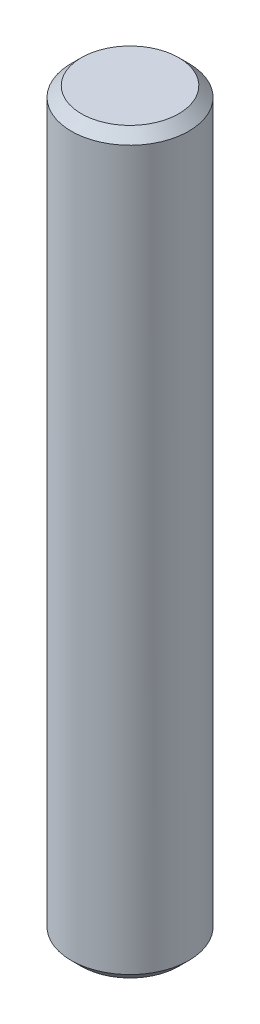
ISO-10303-21;
HEADER;
FILE_DESCRIPTION(('STEP AP214'),'2;1');
FILE_NAME('part.step','',(''),(''),'','','');
FILE_SCHEMA(('AUTOMOTIVE_DESIGN { 1 0 10303 214 1 1 1 1 }'));
ENDSEC;
DATA;
#1=APPLICATION_CONTEXT('core data for automotive mechanical design processes');
#2=APPLICATION_PROTOCOL_DEFINITION('international standard','automotive_design',2000,#1);
#3=PRODUCT_CONTEXT('',#1,'mechanical');
#4=PRODUCT('Part','Part','',(#3));
#5=PRODUCT_RELATED_PRODUCT_CATEGORY('part','',(#4));
#6=PRODUCT_DEFINITION_FORMATION('','',#4);
#7=PRODUCT_DEFINITION_CONTEXT('part definition',#1,'design');
#8=PRODUCT_DEFINITION('design','',#6,#7);
#9=PRODUCT_DEFINITION_SHAPE('','',#8);
#10=(LENGTH_UNIT() NAMED_UNIT(*) SI_UNIT(.MILLI.,.METRE.));
#11=(NAMED_UNIT(*) PLANE_ANGLE_UNIT() SI_UNIT($,.RADIAN.));
#12=(NAMED_UNIT(*) SI_UNIT($,.STERADIAN.) SOLID_ANGLE_UNIT());
#13=UNCERTAINTY_MEASURE_WITH_UNIT(LENGTH_MEASURE(1.E-05),#10,'distance_accuracy_value','');
#14=(GEOMETRIC_REPRESENTATION_CONTEXT(3) GLOBAL_UNCERTAINTY_ASSIGNED_CONTEXT((#13)) GLOBAL_UNIT_ASSIGNED_CONTEXT((#10,
#11,#12)) REPRESENTATION_CONTEXT('',''));
#15=CARTESIAN_POINT('',(0.,0.,0.));
#16=DIRECTION('',(0.,0.,1.));
#17=DIRECTION('',(1.,0.,0.));
#18=AXIS2_PLACEMENT_3D('',#15,#16,#17);
#19=CARTESIAN_POINT('',(0.,32.,0.));
#20=DIRECTION('',(0.,-1.,0.));
#21=DIRECTION('',(0.,0.,-1.));
#22=AXIS2_PLACEMENT_3D('',#19,#20,#21);
#23=CYLINDRICAL_SURFACE('',#22,3.5);
#24=CARTESIAN_POINT('',(0.,-11.4,0.));
#25=DIRECTION('',(0.,1.,0.));
#26=DIRECTION('',(0.,0.,1.));
#27=AXIS2_PLACEMENT_3D('',#24,#25,#26);
#28=CIRCLE('',#27,3.5);
#29=CARTESIAN_POINT('',(0.,-11.4,3.5));
#30=VERTEX_POINT('',#29);
#31=EDGE_CURVE('E40',#30,#30,#28,.T.);
#32=ORIENTED_EDGE('',*,*,#31,.T.);
#33=EDGE_LOOP('',(#32));
#34=FACE_BOUND('',#33,.T.);
#35=CARTESIAN_POINT('',(0.,31.4,0.));
#36=DIRECTION('',(0.,1.,0.));
#37=DIRECTION('',(0.,0.,1.));
#38=AXIS2_PLACEMENT_3D('',#35,#36,#37);
#39=CIRCLE('',#38,3.5);
#40=CARTESIAN_POINT('',(0.,31.4,-3.5));
#41=VERTEX_POINT('',#40);
#42=EDGE_CURVE('E44',#41,#41,#39,.F.);
#43=ORIENTED_EDGE('',*,*,#42,.T.);
#44=EDGE_LOOP('',(#43));
#45=FACE_BOUND('',#44,.T.);
#46=ADVANCED_FACE('F30',(#34,#45),#23,.T.);
#47=CARTESIAN_POINT('',(0.,32.,0.));
#48=DIRECTION('',(0.,1.,0.));
#49=DIRECTION('',(0.,0.,1.));
#50=AXIS2_PLACEMENT_3D('',#47,#48,#49);
#51=PLANE('',#50);
#52=CARTESIAN_POINT('',(0.,32.,0.));
#53=DIRECTION('',(0.,1.,0.));
#54=DIRECTION('',(0.,0.,1.));
#55=AXIS2_PLACEMENT_3D('',#52,#53,#54);
#56=CIRCLE('',#55,2.89999999999999);
#57=CARTESIAN_POINT('',(0.,32.,-2.89999999999999));
#58=VERTEX_POINT('',#57);
#59=EDGE_CURVE('E10',#58,#58,#56,.T.);
#60=ORIENTED_EDGE('',*,*,#59,.T.);
#61=EDGE_LOOP('',(#60));
#62=FACE_BOUND('',#61,.T.);
#63=ADVANCED_FACE('F63',(#62),#51,.T.);
#64=CARTESIAN_POINT('',(0.,-12.,0.));
#65=DIRECTION('',(0.,1.,0.));
#66=DIRECTION('',(0.,0.,1.));
#67=AXIS2_PLACEMENT_3D('',#64,#65,#66);
#68=PLANE('',#67);
#69=CARTESIAN_POINT('',(0.,-12.,0.));
#70=DIRECTION('',(0.,1.,0.));
#71=DIRECTION('',(0.,0.,1.));
#72=AXIS2_PLACEMENT_3D('',#69,#70,#71);
#73=CIRCLE('',#72,2.89999999999998);
#74=CARTESIAN_POINT('',(0.,-12.,2.89999999999998));
#75=VERTEX_POINT('',#74);
#76=EDGE_CURVE('E36',#75,#75,#73,.F.);
#77=ORIENTED_EDGE('',*,*,#76,.T.);
#78=EDGE_LOOP('',(#77));
#79=FACE_BOUND('',#78,.T.);
#80=ADVANCED_FACE('F59',(#79),#68,.F.);
#81=CARTESIAN_POINT('',(0.,-11.4,0.));
#82=DIRECTION('',(0.,1.,0.));
#83=DIRECTION('',(0.,0.,1.));
#84=AXIS2_PLACEMENT_3D('',#81,#82,#83);
#85=CONICAL_SURFACE('',#84,3.5,0.785398163397457);
#86=ORIENTED_EDGE('',*,*,#76,.F.);
#87=EDGE_LOOP('',(#86));
#88=FACE_BOUND('',#87,.T.);
#89=ORIENTED_EDGE('',*,*,#31,.F.);
#90=EDGE_LOOP('',(#89));
#91=FACE_BOUND('',#90,.T.);
#92=ADVANCED_FACE('F54',(#88,#91),#85,.T.);
#93=CARTESIAN_POINT('',(0.,32.,0.));
#94=DIRECTION('',(0.,-1.,0.));
#95=DIRECTION('',(0.,0.,-1.));
#96=AXIS2_PLACEMENT_3D('',#93,#94,#95);
#97=CONICAL_SURFACE('',#96,2.89999999999999,0.785398163397451);
#98=CARTESIAN_POINT('',(0.,31.4,-3.5));
#99=CARTESIAN_POINT('',(0.,31.40625,-3.49375));
#100=CARTESIAN_POINT('',(0.,31.4125,-3.4875));
#101=CARTESIAN_POINT('',(0.,31.425,-3.475));
#102=CARTESIAN_POINT('',(0.,31.43125,-3.46875));
#103=CARTESIAN_POINT('',(0.,31.44375,-3.45625));
#104=CARTESIAN_POINT('',(0.,31.45,-3.45));
#105=CARTESIAN_POINT('',(0.,31.4625,-3.4375));
#106=CARTESIAN_POINT('',(0.,31.46875,-3.43125));
#107=CARTESIAN_POINT('',(0.,31.48125,-3.41875));
#108=CARTESIAN_POINT('',(0.,31.4875,-3.4125));
#109=CARTESIAN_POINT('',(0.,31.5,-3.4));
#110=CARTESIAN_POINT('',(0.,31.50625,-3.39375));
#111=CARTESIAN_POINT('',(0.,31.51875,-3.38125));
#112=CARTESIAN_POINT('',(0.,31.525,-3.375));
#113=CARTESIAN_POINT('',(0.,31.5375,-3.3625));
#114=CARTESIAN_POINT('',(0.,31.54375,-3.35625));
#115=CARTESIAN_POINT('',(0.,31.55625,-3.34375));
#116=CARTESIAN_POINT('',(0.,31.5625,-3.3375));
#117=CARTESIAN_POINT('',(0.,31.575,-3.325));
#118=CARTESIAN_POINT('',(0.,31.58125,-3.31875));
#119=CARTESIAN_POINT('',(0.,31.59375,-3.30625));
#120=CARTESIAN_POINT('',(0.,31.6,-3.3));
#121=CARTESIAN_POINT('',(0.,31.6125,-3.2875));
#122=CARTESIAN_POINT('',(0.,31.61875,-3.28125));
#123=CARTESIAN_POINT('',(0.,31.63125,-3.26875));
#124=CARTESIAN_POINT('',(0.,31.6375,-3.2625));
#125=CARTESIAN_POINT('',(0.,31.65,-3.25));
#126=CARTESIAN_POINT('',(0.,31.65625,-3.24375));
#127=CARTESIAN_POINT('',(0.,31.66875,-3.23125));
#128=CARTESIAN_POINT('',(0.,31.675,-3.225));
#129=CARTESIAN_POINT('',(0.,31.6875,-3.2125));
#130=CARTESIAN_POINT('',(0.,31.69375,-3.20625));
#131=CARTESIAN_POINT('',(0.,31.70625,-3.19375));
#132=CARTESIAN_POINT('',(0.,31.7125,-3.1875));
#133=CARTESIAN_POINT('',(0.,31.725,-3.17499999999999));
#134=CARTESIAN_POINT('',(0.,31.73125,-3.16875));
#135=CARTESIAN_POINT('',(0.,31.74375,-3.15625));
#136=CARTESIAN_POINT('',(0.,31.75,-3.15));
#137=CARTESIAN_POINT('',(0.,31.7625,-3.13749999999999));
#138=CARTESIAN_POINT('',(0.,31.76875,-3.13124999999999));
#139=CARTESIAN_POINT('',(0.,31.78125,-3.11874999999999));
#140=CARTESIAN_POINT('',(0.,31.7875,-3.11249999999999));
#141=CARTESIAN_POINT('',(0.,31.8,-3.09999999999999));
#142=CARTESIAN_POINT('',(0.,31.80625,-3.09374999999999));
#143=CARTESIAN_POINT('',(0.,31.81875,-3.08124999999999));
#144=CARTESIAN_POINT('',(0.,31.825,-3.07499999999999));
#145=CARTESIAN_POINT('',(0.,31.8375,-3.06249999999999));
#146=CARTESIAN_POINT('',(0.,31.84375,-3.05624999999999));
#147=CARTESIAN_POINT('',(0.,31.85625,-3.04374999999999));
#148=CARTESIAN_POINT('',(0.,31.8625,-3.03749999999999));
#149=CARTESIAN_POINT('',(0.,31.875,-3.02499999999999));
#150=CARTESIAN_POINT('',(0.,31.88125,-3.01874999999999));
#151=CARTESIAN_POINT('',(0.,31.89375,-3.00624999999999));
#152=CARTESIAN_POINT('',(0.,31.9,-2.99999999999999));
#153=CARTESIAN_POINT('',(0.,31.9125,-2.98749999999999));
#154=CARTESIAN_POINT('',(0.,31.91875,-2.98124999999999));
#155=CARTESIAN_POINT('',(0.,31.93125,-2.96874999999999));
#156=CARTESIAN_POINT('',(0.,31.9375,-2.96249999999999));
#157=CARTESIAN_POINT('',(0.,31.95,-2.94999999999999));
#158=CARTESIAN_POINT('',(0.,31.95625,-2.94374999999999));
#159=CARTESIAN_POINT('',(0.,31.96875,-2.93124999999999));
#160=CARTESIAN_POINT('',(0.,31.975,-2.92499999999999));
#161=CARTESIAN_POINT('',(0.,31.9875,-2.91249999999999));
#162=CARTESIAN_POINT('',(0.,31.99375,-2.90624999999999));
#163=CARTESIAN_POINT('',(0.,32.,-2.89999999999999));
#164=B_SPLINE_CURVE_WITH_KNOTS('',3,(#98,#99,#100,#101,#102,#103,#104,#105,#106,#107,#108,#109,
#110,#111,#112,#113,#114,#115,#116,#117,#118,#119,#120,#121,#122,#123,#124,#125,#126,#127,#128,
#129,#130,#131,#132,#133,#134,#135,#136,#137,#138,#139,#140,#141,#142,#143,#144,#145,#146,#147,
#148,#149,#150,#151,#152,#153,#154,#155,#156,#157,#158,#159,#160,#161,#162,#163),.UNSPECIFIED.,
.F.,.F.,(4,2,2,2,2,2,2,2,2,2,2,2,2,2,2,2,2,2,2,2,2,2,2,2,2,2,2,2,2,2,2,2,4),(0.,
0.0265165042944944,0.0530330085889889,0.079549512883488,0.106066017177982,0.132582521472477,
0.159099025766976,0.18561553006147,0.212132034355965,0.238648538650464,0.265165042944959,
0.291681547239453,0.318198051533952,0.344714555828447,0.371231060122941,0.39774756441744,
0.424264068711935,0.450780573006429,0.477297077300928,0.503813581595422,0.530330085889917,
0.556846590184416,0.58336309447891,0.609879598773405,0.636396103067904,0.662912607362399,
0.689429111656893,0.715945615951392,0.742462120245887,0.768978624540381,0.79549512883488,
0.822011633129375,0.848528137423874),.UNSPECIFIED.);
#165=EDGE_CURVE('BSEAM51',#41,#58,#164,.T.);
#166=ORIENTED_EDGE('',*,*,#42,.F.);
#167=ORIENTED_EDGE('',*,*,#59,.F.);
#168=ORIENTED_EDGE('',*,*,#165,.T.);
#169=ORIENTED_EDGE('',*,*,#165,.F.);
#170=EDGE_LOOP('',(#166,#168,#167,#169));
#171=FACE_BOUND('',#170,.T.);
#172=ADVANCED_FACE('F51',(#171),#97,.T.);
#173=CLOSED_SHELL('',(#46,#63,#80,#92,#172));
#174=MANIFOLD_SOLID_BREP('B2',#173);
#175=ADVANCED_BREP_SHAPE_REPRESENTATION('',(#18,#174),#14);
#176=SHAPE_DEFINITION_REPRESENTATION(#9,#175);
ENDSEC;
END-ISO-10303-21;
